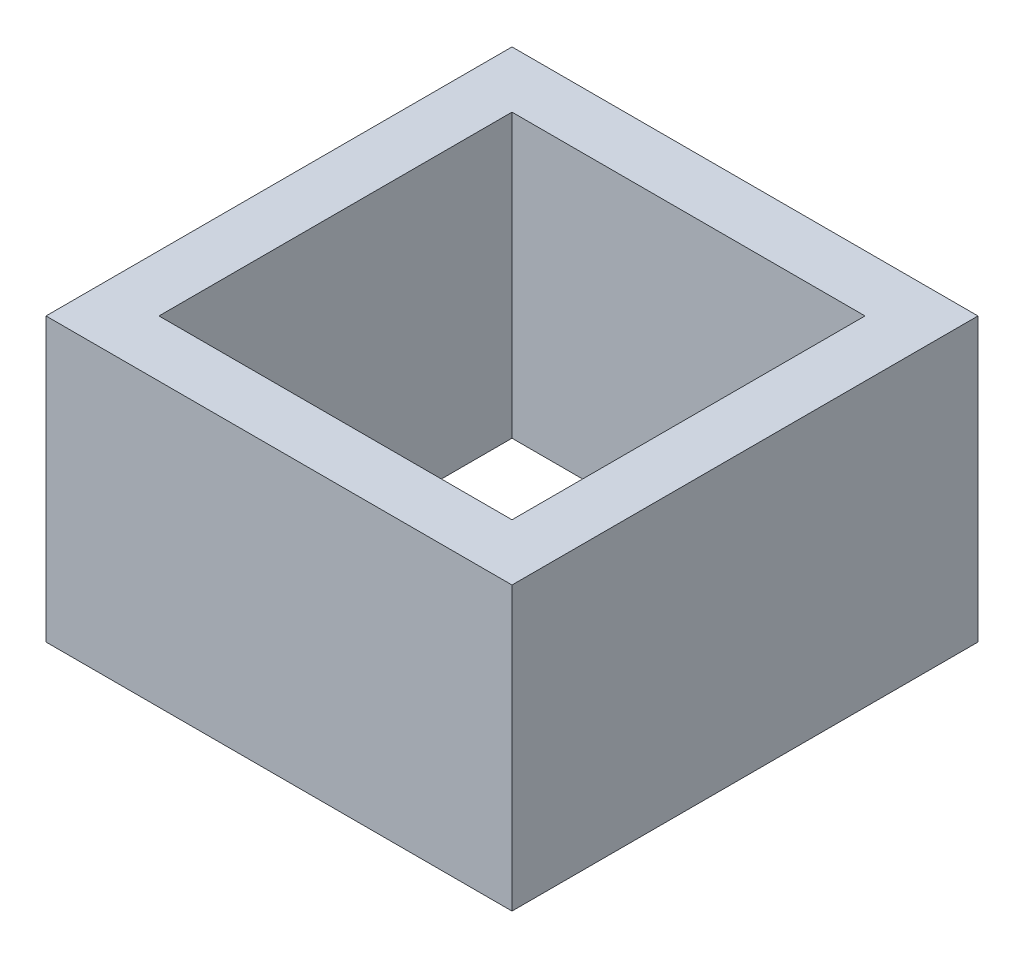
ISO-10303-21;
HEADER;
FILE_DESCRIPTION(('STEP AP214'),'2;1');
FILE_NAME('part.step','',(''),(''),'','','');
FILE_SCHEMA(('AUTOMOTIVE_DESIGN { 1 0 10303 214 1 1 1 1 }'));
ENDSEC;
DATA;
#1=APPLICATION_CONTEXT('core data for automotive mechanical design processes');
#2=APPLICATION_PROTOCOL_DEFINITION('international standard','automotive_design',2000,#1);
#3=PRODUCT_CONTEXT('',#1,'mechanical');
#4=PRODUCT('Part','Part','',(#3));
#5=PRODUCT_RELATED_PRODUCT_CATEGORY('part','',(#4));
#6=PRODUCT_DEFINITION_FORMATION('','',#4);
#7=PRODUCT_DEFINITION_CONTEXT('part definition',#1,'design');
#8=PRODUCT_DEFINITION('design','',#6,#7);
#9=PRODUCT_DEFINITION_SHAPE('','',#8);
#10=(LENGTH_UNIT() NAMED_UNIT(*) SI_UNIT(.MILLI.,.METRE.));
#11=(NAMED_UNIT(*) PLANE_ANGLE_UNIT() SI_UNIT($,.RADIAN.));
#12=(NAMED_UNIT(*) SI_UNIT($,.STERADIAN.) SOLID_ANGLE_UNIT());
#13=UNCERTAINTY_MEASURE_WITH_UNIT(LENGTH_MEASURE(1.E-05),#10,'distance_accuracy_value','');
#14=(GEOMETRIC_REPRESENTATION_CONTEXT(3) GLOBAL_UNCERTAINTY_ASSIGNED_CONTEXT((#13)) GLOBAL_UNIT_ASSIGNED_CONTEXT((#10,
#11,#12)) REPRESENTATION_CONTEXT('',''));
#15=CARTESIAN_POINT('',(0.,0.,0.));
#16=DIRECTION('',(0.,0.,1.));
#17=DIRECTION('',(1.,0.,0.));
#18=AXIS2_PLACEMENT_3D('',#15,#16,#17);
#19=CARTESIAN_POINT('',(165.,-200.,165.));
#20=DIRECTION('',(1.,0.,0.));
#21=DIRECTION('',(0.,0.,-1.));
#22=AXIS2_PLACEMENT_3D('',#19,#20,#21);
#23=PLANE('',#22);
#24=DIRECTION('',(0.,0.,-1.));
#25=VECTOR('',#24,1.);
#26=CARTESIAN_POINT('',(165.,0.,165.));
#27=LINE('',#26,#25);
#28=CARTESIAN_POINT('',(165.,0.,165.));
#29=VERTEX_POINT('',#28);
#30=CARTESIAN_POINT('',(165.,0.,-165.));
#31=VERTEX_POINT('',#30);
#32=EDGE_CURVE('E152',#29,#31,#27,.T.);
#33=ORIENTED_EDGE('',*,*,#32,.F.);
#34=DIRECTION('',(0.,1.,0.));
#35=VECTOR('',#34,1.);
#36=CARTESIAN_POINT('',(165.,-200.,165.));
#37=LINE('',#36,#35);
#38=CARTESIAN_POINT('',(165.,-200.,165.));
#39=VERTEX_POINT('',#38);
#40=EDGE_CURVE('E11',#39,#29,#37,.T.);
#41=ORIENTED_EDGE('',*,*,#40,.F.);
#42=DIRECTION('',(0.,0.,-1.));
#43=VECTOR('',#42,1.);
#44=CARTESIAN_POINT('',(165.,-200.,165.));
#45=LINE('',#44,#43);
#46=CARTESIAN_POINT('',(165.,-200.,-165.));
#47=VERTEX_POINT('',#46);
#48=EDGE_CURVE('E158',#39,#47,#45,.T.);
#49=ORIENTED_EDGE('',*,*,#48,.T.);
#50=DIRECTION('',(0.,1.,0.));
#51=VECTOR('',#50,1.);
#52=CARTESIAN_POINT('',(165.,-200.,-165.));
#53=LINE('',#52,#51);
#54=EDGE_CURVE('E46',#47,#31,#53,.T.);
#55=ORIENTED_EDGE('',*,*,#54,.T.);
#56=EDGE_LOOP('',(#33,#41,#49,#55));
#57=FACE_BOUND('',#56,.T.);
#58=ADVANCED_FACE('F43',(#57),#23,.T.);
#59=CARTESIAN_POINT('',(-165.,-200.,165.));
#60=DIRECTION('',(0.,0.,1.));
#61=DIRECTION('',(1.,0.,0.));
#62=AXIS2_PLACEMENT_3D('',#59,#60,#61);
#63=PLANE('',#62);
#64=DIRECTION('',(1.,0.,0.));
#65=VECTOR('',#64,1.);
#66=CARTESIAN_POINT('',(-165.,0.,165.));
#67=LINE('',#66,#65);
#68=CARTESIAN_POINT('',(-165.,0.,165.));
#69=VERTEX_POINT('',#68);
#70=EDGE_CURVE('E163',#69,#29,#67,.T.);
#71=ORIENTED_EDGE('',*,*,#70,.F.);
#72=DIRECTION('',(0.,1.,0.));
#73=VECTOR('',#72,1.);
#74=CARTESIAN_POINT('',(-165.,-200.,165.));
#75=LINE('',#74,#73);
#76=CARTESIAN_POINT('',(-165.,-200.,165.));
#77=VERTEX_POINT('',#76);
#78=EDGE_CURVE('E52',#77,#69,#75,.T.);
#79=ORIENTED_EDGE('',*,*,#78,.F.);
#80=DIRECTION('',(1.,0.,0.));
#81=VECTOR('',#80,1.);
#82=CARTESIAN_POINT('',(-165.,-200.,165.));
#83=LINE('',#82,#81);
#84=EDGE_CURVE('E171',#77,#39,#83,.T.);
#85=ORIENTED_EDGE('',*,*,#84,.T.);
#86=ORIENTED_EDGE('',*,*,#40,.T.);
#87=EDGE_LOOP('',(#71,#79,#85,#86));
#88=FACE_BOUND('',#87,.T.);
#89=ADVANCED_FACE('F205',(#88),#63,.T.);
#90=CARTESIAN_POINT('',(-165.,-200.,165.));
#91=DIRECTION('',(-1.,0.,0.));
#92=DIRECTION('',(0.,0.,1.));
#93=AXIS2_PLACEMENT_3D('',#90,#91,#92);
#94=PLANE('',#93);
#95=DIRECTION('',(0.,0.,1.));
#96=VECTOR('',#95,1.);
#97=CARTESIAN_POINT('',(-165.,0.,165.));
#98=LINE('',#97,#96);
#99=CARTESIAN_POINT('',(-165.,0.,-165.));
#100=VERTEX_POINT('',#99);
#101=EDGE_CURVE('E182',#100,#69,#98,.T.);
#102=ORIENTED_EDGE('',*,*,#101,.F.);
#103=DIRECTION('',(0.,1.,0.));
#104=VECTOR('',#103,1.);
#105=CARTESIAN_POINT('',(-165.,-200.,-165.));
#106=LINE('',#105,#104);
#107=CARTESIAN_POINT('',(-165.,-200.,-165.));
#108=VERTEX_POINT('',#107);
#109=EDGE_CURVE('E190',#108,#100,#106,.T.);
#110=ORIENTED_EDGE('',*,*,#109,.F.);
#111=DIRECTION('',(0.,0.,1.));
#112=VECTOR('',#111,1.);
#113=CARTESIAN_POINT('',(-165.,-200.,165.));
#114=LINE('',#113,#112);
#115=EDGE_CURVE('E167',#108,#77,#114,.T.);
#116=ORIENTED_EDGE('',*,*,#115,.T.);
#117=ORIENTED_EDGE('',*,*,#78,.T.);
#118=EDGE_LOOP('',(#102,#110,#116,#117));
#119=FACE_BOUND('',#118,.T.);
#120=ADVANCED_FACE('F209',(#119),#94,.T.);
#121=CARTESIAN_POINT('',(-165.,-200.,-165.));
#122=DIRECTION('',(0.,0.,-1.));
#123=DIRECTION('',(-1.,0.,0.));
#124=AXIS2_PLACEMENT_3D('',#121,#122,#123);
#125=PLANE('',#124);
#126=DIRECTION('',(-1.,0.,0.));
#127=VECTOR('',#126,1.);
#128=CARTESIAN_POINT('',(-165.,0.,-165.));
#129=LINE('',#128,#127);
#130=EDGE_CURVE('E178',#31,#100,#129,.T.);
#131=ORIENTED_EDGE('',*,*,#130,.F.);
#132=ORIENTED_EDGE('',*,*,#54,.F.);
#133=DIRECTION('',(-1.,0.,0.));
#134=VECTOR('',#133,1.);
#135=CARTESIAN_POINT('',(-165.,-200.,-165.));
#136=LINE('',#135,#134);
#137=EDGE_CURVE('E162',#47,#108,#136,.T.);
#138=ORIENTED_EDGE('',*,*,#137,.T.);
#139=ORIENTED_EDGE('',*,*,#109,.T.);
#140=EDGE_LOOP('',(#131,#132,#138,#139));
#141=FACE_BOUND('',#140,.T.);
#142=ADVANCED_FACE('F200',(#141),#125,.T.);
#143=CARTESIAN_POINT('',(0.,-200.,0.));
#144=DIRECTION('',(0.,-1.,0.));
#145=DIRECTION('',(0.,0.,-1.));
#146=AXIS2_PLACEMENT_3D('',#143,#144,#145);
#147=PLANE('',#146);
#148=DIRECTION('',(0.,0.,-1.));
#149=VECTOR('',#148,1.);
#150=CARTESIAN_POINT('',(125.,-200.,125.));
#151=LINE('',#150,#149);
#152=CARTESIAN_POINT('',(125.,-200.,125.));
#153=VERTEX_POINT('',#152);
#154=CARTESIAN_POINT('',(125.,-200.,-125.));
#155=VERTEX_POINT('',#154);
#156=EDGE_CURVE('E111',#153,#155,#151,.T.);
#157=ORIENTED_EDGE('',*,*,#156,.T.);
#158=DIRECTION('',(-1.,0.,0.));
#159=VECTOR('',#158,1.);
#160=CARTESIAN_POINT('',(-125.,-200.,-125.));
#161=LINE('',#160,#159);
#162=CARTESIAN_POINT('',(-125.,-200.,-125.));
#163=VERTEX_POINT('',#162);
#164=EDGE_CURVE('E121',#155,#163,#161,.T.);
#165=ORIENTED_EDGE('',*,*,#164,.T.);
#166=DIRECTION('',(0.,0.,1.));
#167=VECTOR('',#166,1.);
#168=CARTESIAN_POINT('',(-125.,-200.,125.));
#169=LINE('',#168,#167);
#170=CARTESIAN_POINT('',(-125.,-200.,125.));
#171=VERTEX_POINT('',#170);
#172=EDGE_CURVE('E60',#163,#171,#169,.T.);
#173=ORIENTED_EDGE('',*,*,#172,.T.);
#174=DIRECTION('',(1.,0.,0.));
#175=VECTOR('',#174,1.);
#176=CARTESIAN_POINT('',(-125.,-200.,125.));
#177=LINE('',#176,#175);
#178=EDGE_CURVE('E118',#171,#153,#177,.T.);
#179=ORIENTED_EDGE('',*,*,#178,.T.);
#180=EDGE_LOOP('',(#157,#165,#173,#179));
#181=FACE_BOUND('',#180,.T.);
#182=ORIENTED_EDGE('',*,*,#48,.F.);
#183=ORIENTED_EDGE('',*,*,#84,.F.);
#184=ORIENTED_EDGE('',*,*,#115,.F.);
#185=ORIENTED_EDGE('',*,*,#137,.F.);
#186=EDGE_LOOP('',(#182,#183,#184,#185));
#187=FACE_BOUND('',#186,.T.);
#188=ADVANCED_FACE('F126',(#181,#187),#147,.T.);
#189=CARTESIAN_POINT('',(0.,0.,0.));
#190=DIRECTION('',(0.,-1.,0.));
#191=DIRECTION('',(0.,0.,-1.));
#192=AXIS2_PLACEMENT_3D('',#189,#190,#191);
#193=PLANE('',#192);
#194=DIRECTION('',(-1.,0.,0.));
#195=VECTOR('',#194,1.);
#196=CARTESIAN_POINT('',(-125.,0.,-125.));
#197=LINE('',#196,#195);
#198=CARTESIAN_POINT('',(125.,0.,-125.));
#199=VERTEX_POINT('',#198);
#200=CARTESIAN_POINT('',(-125.,0.,-125.));
#201=VERTEX_POINT('',#200);
#202=EDGE_CURVE('E143',#199,#201,#197,.T.);
#203=ORIENTED_EDGE('',*,*,#202,.F.);
#204=DIRECTION('',(0.,0.,-1.));
#205=VECTOR('',#204,1.);
#206=CARTESIAN_POINT('',(125.,0.,125.));
#207=LINE('',#206,#205);
#208=CARTESIAN_POINT('',(125.,0.,125.));
#209=VERTEX_POINT('',#208);
#210=EDGE_CURVE('E68',#209,#199,#207,.T.);
#211=ORIENTED_EDGE('',*,*,#210,.F.);
#212=DIRECTION('',(1.,0.,0.));
#213=VECTOR('',#212,1.);
#214=CARTESIAN_POINT('',(-125.,0.,125.));
#215=LINE('',#214,#213);
#216=CARTESIAN_POINT('',(-125.,0.,125.));
#217=VERTEX_POINT('',#216);
#218=EDGE_CURVE('E130',#217,#209,#215,.T.);
#219=ORIENTED_EDGE('',*,*,#218,.F.);
#220=DIRECTION('',(0.,0.,1.));
#221=VECTOR('',#220,1.);
#222=CARTESIAN_POINT('',(-125.,0.,125.));
#223=LINE('',#222,#221);
#224=EDGE_CURVE('E134',#201,#217,#223,.T.);
#225=ORIENTED_EDGE('',*,*,#224,.F.);
#226=EDGE_LOOP('',(#203,#211,#219,#225));
#227=FACE_BOUND('',#226,.T.);
#228=ORIENTED_EDGE('',*,*,#32,.T.);
#229=ORIENTED_EDGE('',*,*,#130,.T.);
#230=ORIENTED_EDGE('',*,*,#101,.T.);
#231=ORIENTED_EDGE('',*,*,#70,.T.);
#232=EDGE_LOOP('',(#228,#229,#230,#231));
#233=FACE_BOUND('',#232,.T.);
#234=ADVANCED_FACE('F202',(#227,#233),#193,.F.);
#235=CARTESIAN_POINT('',(125.,-200.,125.));
#236=DIRECTION('',(1.,0.,0.));
#237=DIRECTION('',(0.,0.,-1.));
#238=AXIS2_PLACEMENT_3D('',#235,#236,#237);
#239=PLANE('',#238);
#240=ORIENTED_EDGE('',*,*,#210,.T.);
#241=DIRECTION('',(0.,1.,0.));
#242=VECTOR('',#241,1.);
#243=CARTESIAN_POINT('',(125.,-200.,-125.));
#244=LINE('',#243,#242);
#245=EDGE_CURVE('E107',#155,#199,#244,.T.);
#246=ORIENTED_EDGE('',*,*,#245,.F.);
#247=ORIENTED_EDGE('',*,*,#156,.F.);
#248=DIRECTION('',(0.,1.,0.));
#249=VECTOR('',#248,1.);
#250=CARTESIAN_POINT('',(125.,-200.,125.));
#251=LINE('',#250,#249);
#252=EDGE_CURVE('E149',#153,#209,#251,.T.);
#253=ORIENTED_EDGE('',*,*,#252,.T.);
#254=EDGE_LOOP('',(#240,#246,#247,#253));
#255=FACE_BOUND('',#254,.T.);
#256=ADVANCED_FACE('F109',(#255),#239,.F.);
#257=CARTESIAN_POINT('',(-125.,-200.,125.));
#258=DIRECTION('',(0.,0.,1.));
#259=DIRECTION('',(1.,0.,0.));
#260=AXIS2_PLACEMENT_3D('',#257,#258,#259);
#261=PLANE('',#260);
#262=ORIENTED_EDGE('',*,*,#218,.T.);
#263=ORIENTED_EDGE('',*,*,#252,.F.);
#264=ORIENTED_EDGE('',*,*,#178,.F.);
#265=DIRECTION('',(0.,1.,0.));
#266=VECTOR('',#265,1.);
#267=CARTESIAN_POINT('',(-125.,-200.,125.));
#268=LINE('',#267,#266);
#269=EDGE_CURVE('E153',#171,#217,#268,.T.);
#270=ORIENTED_EDGE('',*,*,#269,.T.);
#271=EDGE_LOOP('',(#262,#263,#264,#270));
#272=FACE_BOUND('',#271,.T.);
#273=ADVANCED_FACE('F265',(#272),#261,.F.);
#274=CARTESIAN_POINT('',(-125.,-200.,125.));
#275=DIRECTION('',(-1.,0.,0.));
#276=DIRECTION('',(0.,0.,1.));
#277=AXIS2_PLACEMENT_3D('',#274,#275,#276);
#278=PLANE('',#277);
#279=ORIENTED_EDGE('',*,*,#224,.T.);
#280=ORIENTED_EDGE('',*,*,#269,.F.);
#281=ORIENTED_EDGE('',*,*,#172,.F.);
#282=DIRECTION('',(0.,1.,0.));
#283=VECTOR('',#282,1.);
#284=CARTESIAN_POINT('',(-125.,-200.,-125.));
#285=LINE('',#284,#283);
#286=EDGE_CURVE('E117',#163,#201,#285,.T.);
#287=ORIENTED_EDGE('',*,*,#286,.T.);
#288=EDGE_LOOP('',(#279,#280,#281,#287));
#289=FACE_BOUND('',#288,.T.);
#290=ADVANCED_FACE('F275',(#289),#278,.F.);
#291=CARTESIAN_POINT('',(-125.,-200.,-125.));
#292=DIRECTION('',(0.,0.,-1.));
#293=DIRECTION('',(-1.,0.,0.));
#294=AXIS2_PLACEMENT_3D('',#291,#292,#293);
#295=PLANE('',#294);
#296=ORIENTED_EDGE('',*,*,#202,.T.);
#297=ORIENTED_EDGE('',*,*,#286,.F.);
#298=ORIENTED_EDGE('',*,*,#164,.F.);
#299=ORIENTED_EDGE('',*,*,#245,.T.);
#300=EDGE_LOOP('',(#296,#297,#298,#299));
#301=FACE_BOUND('',#300,.T.);
#302=ADVANCED_FACE('F122',(#301),#295,.F.);
#303=CLOSED_SHELL('',(#58,#89,#120,#142,#188,#234,#256,#273,#290,#302));
#304=MANIFOLD_SOLID_BREP('B2',#303);
#305=ADVANCED_BREP_SHAPE_REPRESENTATION('',(#18,#304),#14);
#306=SHAPE_DEFINITION_REPRESENTATION(#9,#305);
ENDSEC;
END-ISO-10303-21;
